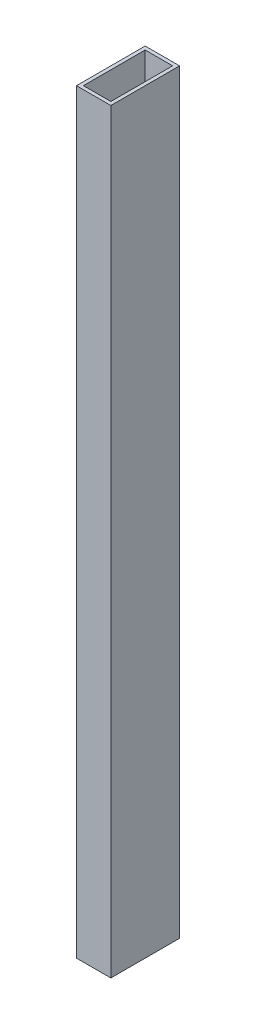
ISO-10303-21;
HEADER;
FILE_DESCRIPTION(('STEP AP214'),'2;1');
FILE_NAME('part.step','',(''),(''),'','','');
FILE_SCHEMA(('AUTOMOTIVE_DESIGN { 1 0 10303 214 1 1 1 1 }'));
ENDSEC;
DATA;
#1=APPLICATION_CONTEXT('core data for automotive mechanical design processes');
#2=APPLICATION_PROTOCOL_DEFINITION('international standard','automotive_design',2000,#1);
#3=PRODUCT_CONTEXT('',#1,'mechanical');
#4=PRODUCT('Part','Part','',(#3));
#5=PRODUCT_RELATED_PRODUCT_CATEGORY('part','',(#4));
#6=PRODUCT_DEFINITION_FORMATION('','',#4);
#7=PRODUCT_DEFINITION_CONTEXT('part definition',#1,'design');
#8=PRODUCT_DEFINITION('design','',#6,#7);
#9=PRODUCT_DEFINITION_SHAPE('','',#8);
#10=(LENGTH_UNIT() NAMED_UNIT(*) SI_UNIT(.MILLI.,.METRE.));
#11=(NAMED_UNIT(*) PLANE_ANGLE_UNIT() SI_UNIT($,.RADIAN.));
#12=(NAMED_UNIT(*) SI_UNIT($,.STERADIAN.) SOLID_ANGLE_UNIT());
#13=UNCERTAINTY_MEASURE_WITH_UNIT(LENGTH_MEASURE(1.E-05),#10,'distance_accuracy_value','');
#14=(GEOMETRIC_REPRESENTATION_CONTEXT(3) GLOBAL_UNCERTAINTY_ASSIGNED_CONTEXT((#13)) GLOBAL_UNIT_ASSIGNED_CONTEXT((#10,
#11,#12)) REPRESENTATION_CONTEXT('',''));
#15=CARTESIAN_POINT('',(0.,0.,0.));
#16=DIRECTION('',(0.,0.,1.));
#17=DIRECTION('',(1.,0.,0.));
#18=AXIS2_PLACEMENT_3D('',#15,#16,#17);
#19=CARTESIAN_POINT('',(0.,558.8,0.));
#20=DIRECTION('',(0.,1.,0.));
#21=DIRECTION('',(0.,0.,1.));
#22=AXIS2_PLACEMENT_3D('',#19,#20,#21);
#23=PLANE('',#22);
#24=DIRECTION('',(1.,0.,0.));
#25=VECTOR('',#24,1.);
#26=CARTESIAN_POINT('',(0.,558.8,0.));
#27=LINE('',#26,#25);
#28=CARTESIAN_POINT('',(0.,558.8,0.));
#29=VERTEX_POINT('',#28);
#30=CARTESIAN_POINT('',(25.4,558.8,0.));
#31=VERTEX_POINT('',#30);
#32=EDGE_CURVE('E153',#29,#31,#27,.T.);
#33=ORIENTED_EDGE('',*,*,#32,.T.);
#34=DIRECTION('',(0.,0.,-1.));
#35=VECTOR('',#34,1.);
#36=CARTESIAN_POINT('',(25.4,558.8,0.));
#37=LINE('',#36,#35);
#38=CARTESIAN_POINT('',(25.4,558.8,-50.8));
#39=VERTEX_POINT('',#38);
#40=EDGE_CURVE('E157',#31,#39,#37,.T.);
#41=ORIENTED_EDGE('',*,*,#40,.T.);
#42=DIRECTION('',(1.,0.,0.));
#43=VECTOR('',#42,1.);
#44=CARTESIAN_POINT('',(0.,558.8,-50.8));
#45=LINE('',#44,#43);
#46=CARTESIAN_POINT('',(0.,558.8,-50.8));
#47=VERTEX_POINT('',#46);
#48=EDGE_CURVE('E161',#47,#39,#45,.T.);
#49=ORIENTED_EDGE('',*,*,#48,.F.);
#50=DIRECTION('',(0.,0.,-1.));
#51=VECTOR('',#50,1.);
#52=CARTESIAN_POINT('',(0.,558.8,0.));
#53=LINE('',#52,#51);
#54=EDGE_CURVE('E165',#29,#47,#53,.T.);
#55=ORIENTED_EDGE('',*,*,#54,.F.);
#56=EDGE_LOOP('',(#33,#41,#49,#55));
#57=FACE_BOUND('',#56,.T.);
#58=DIRECTION('',(0.,0.,1.));
#59=VECTOR('',#58,1.);
#60=CARTESIAN_POINT('',(2.53999999999999,558.8,-48.26));
#61=LINE('',#60,#59);
#62=CARTESIAN_POINT('',(2.53999999999999,558.8,-48.26));
#63=VERTEX_POINT('',#62);
#64=CARTESIAN_POINT('',(2.53999999999999,558.8,-2.54));
#65=VERTEX_POINT('',#64);
#66=EDGE_CURVE('E116',#63,#65,#61,.T.);
#67=ORIENTED_EDGE('',*,*,#66,.F.);
#68=DIRECTION('',(1.,0.,0.));
#69=VECTOR('',#68,1.);
#70=CARTESIAN_POINT('',(2.53999999999999,558.8,-48.26));
#71=LINE('',#70,#69);
#72=CARTESIAN_POINT('',(22.86,558.8,-48.26));
#73=VERTEX_POINT('',#72);
#74=EDGE_CURVE('E55',#63,#73,#71,.T.);
#75=ORIENTED_EDGE('',*,*,#74,.T.);
#76=DIRECTION('',(0.,0.,1.));
#77=VECTOR('',#76,1.);
#78=CARTESIAN_POINT('',(22.86,558.8,-48.26));
#79=LINE('',#78,#77);
#80=CARTESIAN_POINT('',(22.86,558.8,-2.54));
#81=VERTEX_POINT('',#80);
#82=EDGE_CURVE('E121',#73,#81,#79,.T.);
#83=ORIENTED_EDGE('',*,*,#82,.T.);
#84=DIRECTION('',(1.,0.,0.));
#85=VECTOR('',#84,1.);
#86=CARTESIAN_POINT('',(2.53999999999999,558.8,-2.54));
#87=LINE('',#86,#85);
#88=EDGE_CURVE('E139',#65,#81,#87,.T.);
#89=ORIENTED_EDGE('',*,*,#88,.F.);
#90=EDGE_LOOP('',(#67,#75,#83,#89));
#91=FACE_BOUND('',#90,.T.);
#92=ADVANCED_FACE('F39',(#57,#91),#23,.T.);
#93=CARTESIAN_POINT('',(0.,0.,0.));
#94=DIRECTION('',(0.,1.,0.));
#95=DIRECTION('',(0.,0.,1.));
#96=AXIS2_PLACEMENT_3D('',#93,#94,#95);
#97=PLANE('',#96);
#98=DIRECTION('',(1.,0.,0.));
#99=VECTOR('',#98,1.);
#100=CARTESIAN_POINT('',(0.,0.,0.));
#101=LINE('',#100,#99);
#102=CARTESIAN_POINT('',(0.,0.,0.));
#103=VERTEX_POINT('',#102);
#104=CARTESIAN_POINT('',(25.4,0.,0.));
#105=VERTEX_POINT('',#104);
#106=EDGE_CURVE('E123',#103,#105,#101,.T.);
#107=ORIENTED_EDGE('',*,*,#106,.F.);
#108=DIRECTION('',(0.,0.,-1.));
#109=VECTOR('',#108,1.);
#110=CARTESIAN_POINT('',(0.,0.,0.));
#111=LINE('',#110,#109);
#112=CARTESIAN_POINT('',(0.,0.,-50.8));
#113=VERTEX_POINT('',#112);
#114=EDGE_CURVE('E158',#103,#113,#111,.T.);
#115=ORIENTED_EDGE('',*,*,#114,.T.);
#116=DIRECTION('',(1.,0.,0.));
#117=VECTOR('',#116,1.);
#118=CARTESIAN_POINT('',(0.,0.,-50.8));
#119=LINE('',#118,#117);
#120=CARTESIAN_POINT('',(25.4,0.,-50.8));
#121=VERTEX_POINT('',#120);
#122=EDGE_CURVE('E177',#113,#121,#119,.T.);
#123=ORIENTED_EDGE('',*,*,#122,.T.);
#124=DIRECTION('',(0.,0.,-1.));
#125=VECTOR('',#124,1.);
#126=CARTESIAN_POINT('',(25.4,0.,0.));
#127=LINE('',#126,#125);
#128=EDGE_CURVE('E173',#105,#121,#127,.T.);
#129=ORIENTED_EDGE('',*,*,#128,.F.);
#130=EDGE_LOOP('',(#107,#115,#123,#129));
#131=FACE_BOUND('',#130,.T.);
#132=DIRECTION('',(1.,0.,0.));
#133=VECTOR('',#132,1.);
#134=CARTESIAN_POINT('',(2.53999999999999,0.,-48.26));
#135=LINE('',#134,#133);
#136=CARTESIAN_POINT('',(2.53999999999999,0.,-48.26));
#137=VERTEX_POINT('',#136);
#138=CARTESIAN_POINT('',(22.86,0.,-48.26));
#139=VERTEX_POINT('',#138);
#140=EDGE_CURVE('E105',#137,#139,#135,.T.);
#141=ORIENTED_EDGE('',*,*,#140,.F.);
#142=DIRECTION('',(0.,0.,1.));
#143=VECTOR('',#142,1.);
#144=CARTESIAN_POINT('',(2.53999999999999,0.,-48.26));
#145=LINE('',#144,#143);
#146=CARTESIAN_POINT('',(2.53999999999999,0.,-2.54));
#147=VERTEX_POINT('',#146);
#148=EDGE_CURVE('E130',#137,#147,#145,.T.);
#149=ORIENTED_EDGE('',*,*,#148,.T.);
#150=DIRECTION('',(1.,0.,0.));
#151=VECTOR('',#150,1.);
#152=CARTESIAN_POINT('',(2.53999999999999,0.,-2.54));
#153=LINE('',#152,#151);
#154=CARTESIAN_POINT('',(22.86,0.,-2.54));
#155=VERTEX_POINT('',#154);
#156=EDGE_CURVE('E63',#147,#155,#153,.T.);
#157=ORIENTED_EDGE('',*,*,#156,.T.);
#158=DIRECTION('',(0.,0.,1.));
#159=VECTOR('',#158,1.);
#160=CARTESIAN_POINT('',(22.86,0.,-48.26));
#161=LINE('',#160,#159);
#162=EDGE_CURVE('E115',#139,#155,#161,.T.);
#163=ORIENTED_EDGE('',*,*,#162,.F.);
#164=EDGE_LOOP('',(#141,#149,#157,#163));
#165=FACE_BOUND('',#164,.T.);
#166=ADVANCED_FACE('F126',(#131,#165),#97,.F.);
#167=CARTESIAN_POINT('',(0.,558.8,0.));
#168=DIRECTION('',(0.,0.,-1.));
#169=DIRECTION('',(-1.,0.,0.));
#170=AXIS2_PLACEMENT_3D('',#167,#168,#169);
#171=PLANE('',#170);
#172=ORIENTED_EDGE('',*,*,#106,.T.);
#173=DIRECTION('',(0.,-1.,0.));
#174=VECTOR('',#173,1.);
#175=CARTESIAN_POINT('',(25.4,558.8,0.));
#176=LINE('',#175,#174);
#177=EDGE_CURVE('E11',#31,#105,#176,.T.);
#178=ORIENTED_EDGE('',*,*,#177,.F.);
#179=ORIENTED_EDGE('',*,*,#32,.F.);
#180=DIRECTION('',(0.,-1.,0.));
#181=VECTOR('',#180,1.);
#182=CARTESIAN_POINT('',(0.,558.8,0.));
#183=LINE('',#182,#181);
#184=EDGE_CURVE('E169',#29,#103,#183,.T.);
#185=ORIENTED_EDGE('',*,*,#184,.T.);
#186=EDGE_LOOP('',(#172,#178,#179,#185));
#187=FACE_BOUND('',#186,.T.);
#188=ADVANCED_FACE('F41',(#187),#171,.F.);
#189=CARTESIAN_POINT('',(25.4,558.8,0.));
#190=DIRECTION('',(-1.,0.,0.));
#191=DIRECTION('',(0.,0.,1.));
#192=AXIS2_PLACEMENT_3D('',#189,#190,#191);
#193=PLANE('',#192);
#194=ORIENTED_EDGE('',*,*,#128,.T.);
#195=DIRECTION('',(0.,-1.,0.));
#196=VECTOR('',#195,1.);
#197=CARTESIAN_POINT('',(25.4,558.8,-50.8));
#198=LINE('',#197,#196);
#199=EDGE_CURVE('E48',#39,#121,#198,.T.);
#200=ORIENTED_EDGE('',*,*,#199,.F.);
#201=ORIENTED_EDGE('',*,*,#40,.F.);
#202=ORIENTED_EDGE('',*,*,#177,.T.);
#203=EDGE_LOOP('',(#194,#200,#201,#202));
#204=FACE_BOUND('',#203,.T.);
#205=ADVANCED_FACE('F195',(#204),#193,.F.);
#206=CARTESIAN_POINT('',(0.,558.8,-50.8));
#207=DIRECTION('',(0.,0.,-1.));
#208=DIRECTION('',(-1.,0.,0.));
#209=AXIS2_PLACEMENT_3D('',#206,#207,#208);
#210=PLANE('',#209);
#211=ORIENTED_EDGE('',*,*,#122,.F.);
#212=DIRECTION('',(0.,-1.,0.));
#213=VECTOR('',#212,1.);
#214=CARTESIAN_POINT('',(0.,558.8,-50.8));
#215=LINE('',#214,#213);
#216=EDGE_CURVE('E186',#47,#113,#215,.T.);
#217=ORIENTED_EDGE('',*,*,#216,.F.);
#218=ORIENTED_EDGE('',*,*,#48,.T.);
#219=ORIENTED_EDGE('',*,*,#199,.T.);
#220=EDGE_LOOP('',(#211,#217,#218,#219));
#221=FACE_BOUND('',#220,.T.);
#222=ADVANCED_FACE('F192',(#221),#210,.T.);
#223=CARTESIAN_POINT('',(0.,558.8,0.));
#224=DIRECTION('',(-1.,0.,0.));
#225=DIRECTION('',(0.,0.,1.));
#226=AXIS2_PLACEMENT_3D('',#223,#224,#225);
#227=PLANE('',#226);
#228=ORIENTED_EDGE('',*,*,#114,.F.);
#229=ORIENTED_EDGE('',*,*,#184,.F.);
#230=ORIENTED_EDGE('',*,*,#54,.T.);
#231=ORIENTED_EDGE('',*,*,#216,.T.);
#232=EDGE_LOOP('',(#228,#229,#230,#231));
#233=FACE_BOUND('',#232,.T.);
#234=ADVANCED_FACE('F201',(#233),#227,.T.);
#235=CARTESIAN_POINT('',(2.53999999999999,0.,-48.26));
#236=DIRECTION('',(0.,0.,1.));
#237=DIRECTION('',(1.,0.,0.));
#238=AXIS2_PLACEMENT_3D('',#235,#236,#237);
#239=PLANE('',#238);
#240=ORIENTED_EDGE('',*,*,#74,.F.);
#241=DIRECTION('',(0.,1.,0.));
#242=VECTOR('',#241,1.);
#243=CARTESIAN_POINT('',(2.53999999999999,0.,-48.26));
#244=LINE('',#243,#242);
#245=EDGE_CURVE('E109',#137,#63,#244,.T.);
#246=ORIENTED_EDGE('',*,*,#245,.F.);
#247=ORIENTED_EDGE('',*,*,#140,.T.);
#248=DIRECTION('',(0.,1.,0.));
#249=VECTOR('',#248,1.);
#250=CARTESIAN_POINT('',(22.86,0.,-48.26));
#251=LINE('',#250,#249);
#252=EDGE_CURVE('E108',#139,#73,#251,.T.);
#253=ORIENTED_EDGE('',*,*,#252,.T.);
#254=EDGE_LOOP('',(#240,#246,#247,#253));
#255=FACE_BOUND('',#254,.T.);
#256=ADVANCED_FACE('F107',(#255),#239,.T.);
#257=CARTESIAN_POINT('',(22.86,0.,-48.26));
#258=DIRECTION('',(-1.,0.,0.));
#259=DIRECTION('',(0.,0.,1.));
#260=AXIS2_PLACEMENT_3D('',#257,#258,#259);
#261=PLANE('',#260);
#262=ORIENTED_EDGE('',*,*,#82,.F.);
#263=ORIENTED_EDGE('',*,*,#252,.F.);
#264=ORIENTED_EDGE('',*,*,#162,.T.);
#265=DIRECTION('',(0.,1.,0.));
#266=VECTOR('',#265,1.);
#267=CARTESIAN_POINT('',(22.86,0.,-2.54));
#268=LINE('',#267,#266);
#269=EDGE_CURVE('E124',#155,#81,#268,.T.);
#270=ORIENTED_EDGE('',*,*,#269,.T.);
#271=EDGE_LOOP('',(#262,#263,#264,#270));
#272=FACE_BOUND('',#271,.T.);
#273=ADVANCED_FACE('F119',(#272),#261,.T.);
#274=CARTESIAN_POINT('',(2.53999999999999,0.,-2.54));
#275=DIRECTION('',(0.,0.,1.));
#276=DIRECTION('',(1.,0.,0.));
#277=AXIS2_PLACEMENT_3D('',#274,#275,#276);
#278=PLANE('',#277);
#279=ORIENTED_EDGE('',*,*,#88,.T.);
#280=ORIENTED_EDGE('',*,*,#269,.F.);
#281=ORIENTED_EDGE('',*,*,#156,.F.);
#282=DIRECTION('',(0.,1.,0.));
#283=VECTOR('',#282,1.);
#284=CARTESIAN_POINT('',(2.53999999999999,0.,-2.54));
#285=LINE('',#284,#283);
#286=EDGE_CURVE('E148',#147,#65,#285,.T.);
#287=ORIENTED_EDGE('',*,*,#286,.T.);
#288=EDGE_LOOP('',(#279,#280,#281,#287));
#289=FACE_BOUND('',#288,.T.);
#290=ADVANCED_FACE('F243',(#289),#278,.F.);
#291=CARTESIAN_POINT('',(2.53999999999999,0.,-48.26));
#292=DIRECTION('',(-1.,0.,0.));
#293=DIRECTION('',(0.,0.,1.));
#294=AXIS2_PLACEMENT_3D('',#291,#292,#293);
#295=PLANE('',#294);
#296=ORIENTED_EDGE('',*,*,#66,.T.);
#297=ORIENTED_EDGE('',*,*,#286,.F.);
#298=ORIENTED_EDGE('',*,*,#148,.F.);
#299=ORIENTED_EDGE('',*,*,#245,.T.);
#300=EDGE_LOOP('',(#296,#297,#298,#299));
#301=FACE_BOUND('',#300,.T.);
#302=ADVANCED_FACE('F249',(#301),#295,.F.);
#303=CLOSED_SHELL('',(#92,#166,#188,#205,#222,#234,#256,#273,#290,#302));
#304=MANIFOLD_SOLID_BREP('B2',#303);
#305=ADVANCED_BREP_SHAPE_REPRESENTATION('',(#18,#304),#14);
#306=SHAPE_DEFINITION_REPRESENTATION(#9,#305);
ENDSEC;
END-ISO-10303-21;
